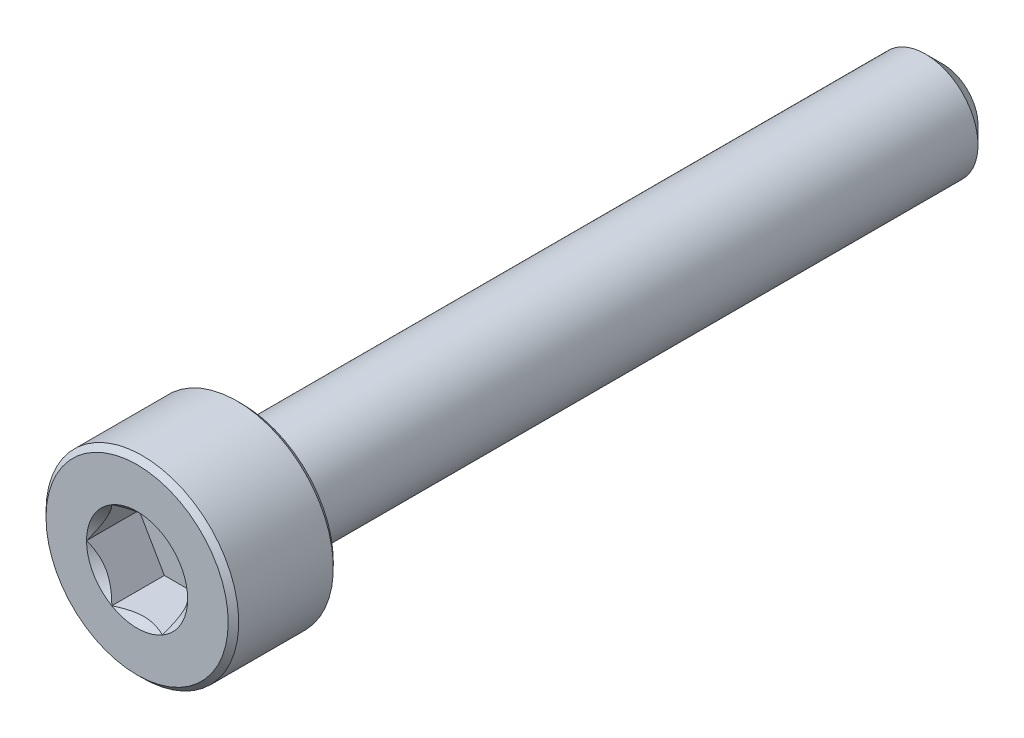
ISO-10303-21;
HEADER;
FILE_DESCRIPTION(('STEP AP214'),'2;1');
FILE_NAME('part.step','',(''),(''),'','','');
FILE_SCHEMA(('AUTOMOTIVE_DESIGN { 1 0 10303 214 1 1 1 1 }'));
ENDSEC;
DATA;
#1=APPLICATION_CONTEXT('core data for automotive mechanical design processes');
#2=APPLICATION_PROTOCOL_DEFINITION('international standard','automotive_design',2000,#1);
#3=PRODUCT_CONTEXT('',#1,'mechanical');
#4=PRODUCT('Part','Part','',(#3));
#5=PRODUCT_RELATED_PRODUCT_CATEGORY('part','',(#4));
#6=PRODUCT_DEFINITION_FORMATION('','',#4);
#7=PRODUCT_DEFINITION_CONTEXT('part definition',#1,'design');
#8=PRODUCT_DEFINITION('design','',#6,#7);
#9=PRODUCT_DEFINITION_SHAPE('','',#8);
#10=(LENGTH_UNIT() NAMED_UNIT(*) SI_UNIT(.MILLI.,.METRE.));
#11=(NAMED_UNIT(*) PLANE_ANGLE_UNIT() SI_UNIT($,.RADIAN.));
#12=(NAMED_UNIT(*) SI_UNIT($,.STERADIAN.) SOLID_ANGLE_UNIT());
#13=UNCERTAINTY_MEASURE_WITH_UNIT(LENGTH_MEASURE(1.E-05),#10,'distance_accuracy_value','');
#14=(GEOMETRIC_REPRESENTATION_CONTEXT(3) GLOBAL_UNCERTAINTY_ASSIGNED_CONTEXT((#13)) GLOBAL_UNIT_ASSIGNED_CONTEXT((#10,
#11,#12)) REPRESENTATION_CONTEXT('',''));
#15=CARTESIAN_POINT('',(0.,0.,0.));
#16=DIRECTION('',(0.,0.,1.));
#17=DIRECTION('',(1.,0.,0.));
#18=AXIS2_PLACEMENT_3D('',#15,#16,#17);
#19=CARTESIAN_POINT('',(1.44337567297406,0.,4.68118692087013));
#20=DIRECTION('',(0.866025403784439,0.5,0.));
#21=DIRECTION('',(0.,0.,-1.));
#22=AXIS2_PLACEMENT_3D('',#19,#20,#21);
#23=PLANE('',#22);
#24=DIRECTION('',(0.,0.,1.));
#25=VECTOR('',#24,1.);
#26=CARTESIAN_POINT('',(1.44337567297406,0.,4.68118692087013));
#27=LINE('',#26,#25);
#28=CARTESIAN_POINT('',(1.44337567297406,0.,10.));
#29=VERTEX_POINT('',#28);
#30=CARTESIAN_POINT('',(1.44337567297406,0.,11.5));
#31=VERTEX_POINT('',#30);
#32=EDGE_CURVE('E11',#29,#31,#27,.T.);
#33=ORIENTED_EDGE('',*,*,#32,.T.);
#34=CARTESIAN_POINT('',(1.44337567297406,0.,11.5));
#35=CARTESIAN_POINT('',(1.41857091071405,0.042963108504013,11.475219039718));
#36=CARTESIAN_POINT('',(1.39335141059849,0.0866445640456516,11.4518937494627));
#37=CARTESIAN_POINT('',(1.34192626179312,0.175715534563345,11.4091861389099));
#38=CARTESIAN_POINT('',(1.31571572524133,0.221113515564678,11.389827573349));
#39=CARTESIAN_POINT('',(1.26286346737866,0.312656311477562,11.3566662159029));
#40=CARTESIAN_POINT('',(1.2362351986357,0.358777825857968,11.3427800967733));
#41=CARTESIAN_POINT('',(1.18239258914488,0.452035961108156,11.3213859017897));
#42=CARTESIAN_POINT('',(1.15517989206246,0.499169735065891,11.3138618619115));
#43=CARTESIAN_POINT('',(1.10827633065602,0.580409086477769,11.3070728277861));
#44=CARTESIAN_POINT('',(1.08864599684083,0.614409822015216,11.3060681886446));
#45=CARTESIAN_POINT('',(1.0494198823342,0.682351445324212,11.3077634952111));
#46=CARTESIAN_POINT('',(1.02982411023275,0.716292318217464,11.3104642592515));
#47=CARTESIAN_POINT('',(0.990821754325344,0.783846380263975,11.3194142483348));
#48=CARTESIAN_POINT('',(0.9714153635362,0.81745923510231,11.3256667730471));
#49=CARTESIAN_POINT('',(0.932926594125732,0.884123739242043,11.3413835392354));
#50=CARTESIAN_POINT('',(0.913844358232443,0.917175141331234,11.3508491588483));
#51=CARTESIAN_POINT('',(0.864994007906013,1.00178643006415,11.3789283315699));
#52=CARTESIAN_POINT('',(0.835533298508111,1.05281387556834,11.3996493450535));
#53=CARTESIAN_POINT('',(0.777764485738233,1.1528723943787,11.4463235058095));
#54=CARTESIAN_POINT('',(0.749452981901493,1.20190935746262,11.4722596212216));
#55=CARTESIAN_POINT('',(0.721687836487032,1.25,11.5));
#56=B_SPLINE_CURVE_WITH_KNOTS('',3,(#34,#35,#36,#37,#38,#39,#40,#41,#42,#43,#44,#45,#46,#47,#48,
#49,#50,#51,#52,#53,#54,#55),.UNSPECIFIED.,.F.,.F.,(4,2,2,2,2,2,2,2,2,2,4),(0.,
0.166478683225849,0.33392692683284,0.498716658518449,0.66309165462856,0.780745575560542,
0.898425484353583,1.01621489977236,1.13405490052654,1.32111591641584,1.50757565758619),.UNSPECIFIED.);
#57=CARTESIAN_POINT('',(0.721687836487031,1.25,11.5));
#58=VERTEX_POINT('',#57);
#59=EDGE_CURVE('E105',#31,#58,#56,.T.);
#60=ORIENTED_EDGE('',*,*,#59,.T.);
#61=DIRECTION('',(0.,0.,1.));
#62=VECTOR('',#61,1.);
#63=CARTESIAN_POINT('',(0.721687836487032,1.25,4.68118692087013));
#64=LINE('',#63,#62);
#65=CARTESIAN_POINT('',(0.721687836487032,1.25,10.));
#66=VERTEX_POINT('',#65);
#67=EDGE_CURVE('E90',#66,#58,#64,.T.);
#68=ORIENTED_EDGE('',*,*,#67,.F.);
#69=DIRECTION('',(0.5,-0.866025403784439,0.));
#70=VECTOR('',#69,1.);
#71=CARTESIAN_POINT('',(1.44337567297406,0.,10.));
#72=LINE('',#71,#70);
#73=EDGE_CURVE('E110',#66,#29,#72,.T.);
#74=ORIENTED_EDGE('',*,*,#73,.T.);
#75=EDGE_LOOP('',(#33,#60,#68,#74));
#76=FACE_BOUND('',#75,.T.);
#77=ADVANCED_FACE('F17',(#76),#23,.F.);
#78=CARTESIAN_POINT('',(0.721687836487031,-1.25,4.68118692087013));
#79=DIRECTION('',(0.866025403784439,-0.5,0.));
#80=DIRECTION('',(0.,0.,-1.));
#81=AXIS2_PLACEMENT_3D('',#78,#79,#80);
#82=PLANE('',#81);
#83=DIRECTION('',(0.,0.,1.));
#84=VECTOR('',#83,1.);
#85=CARTESIAN_POINT('',(0.721687836487031,-1.25,4.68118692087013));
#86=LINE('',#85,#84);
#87=CARTESIAN_POINT('',(0.721687836487031,-1.25,10.));
#88=VERTEX_POINT('',#87);
#89=CARTESIAN_POINT('',(0.721687836487031,-1.25,11.5));
#90=VERTEX_POINT('',#89);
#91=EDGE_CURVE('E34',#88,#90,#86,.T.);
#92=ORIENTED_EDGE('',*,*,#91,.T.);
#93=CARTESIAN_POINT('',(0.721687836487031,-1.25,11.5));
#94=CARTESIAN_POINT('',(0.746492598747046,-1.20703689149599,11.475219039718));
#95=CARTESIAN_POINT('',(0.771712098862606,-1.16335543595435,11.4518937494627));
#96=CARTESIAN_POINT('',(0.823137247667978,-1.07428446543665,11.4091861389099));
#97=CARTESIAN_POINT('',(0.849347784219762,-1.02888648443532,11.389827573349));
#98=CARTESIAN_POINT('',(0.902200042082437,-0.937343688522437,11.3566662159029));
#99=CARTESIAN_POINT('',(0.928828310825398,-0.891222174142031,11.3427800967733));
#100=CARTESIAN_POINT('',(0.982670920316217,-0.797964038891842,11.3213859017897));
#101=CARTESIAN_POINT('',(1.00988361739864,-0.750830264934107,11.3138618619115));
#102=CARTESIAN_POINT('',(1.05678717880508,-0.669590913522229,11.3070728277861));
#103=CARTESIAN_POINT('',(1.07641751262027,-0.635590177984781,11.3060681886446));
#104=CARTESIAN_POINT('',(1.1156436271269,-0.567648554675786,11.3077634952111));
#105=CARTESIAN_POINT('',(1.13523939922835,-0.533707681782533,11.3104642592515));
#106=CARTESIAN_POINT('',(1.17424175513575,-0.466153619736022,11.3194142483348));
#107=CARTESIAN_POINT('',(1.1936481459249,-0.432540764897688,11.3256667730471));
#108=CARTESIAN_POINT('',(1.23213691533536,-0.365876260757955,11.3413835392354));
#109=CARTESIAN_POINT('',(1.25121915122865,-0.332824858668764,11.3508491588483));
#110=CARTESIAN_POINT('',(1.30006950155508,-0.248213569935847,11.3789283315699));
#111=CARTESIAN_POINT('',(1.32953021095299,-0.197186124431659,11.3996493450535));
#112=CARTESIAN_POINT('',(1.38729902372286,-0.097127605621297,11.4463235058095));
#113=CARTESIAN_POINT('',(1.4156105275596,-0.0480906425373818,11.4722596212216));
#114=CARTESIAN_POINT('',(1.44337567297406,0.,11.5));
#115=B_SPLINE_CURVE_WITH_KNOTS('',3,(#93,#94,#95,#96,#97,#98,#99,#100,#101,#102,#103,#104,#105,
#106,#107,#108,#109,#110,#111,#112,#113,#114),.UNSPECIFIED.,.F.,.F.,(4,2,2,2,2,2,2,2,2,2,4),(0.,
0.166478683225851,0.333926926832842,0.498716658518452,0.663091654628563,0.780745575560546,
0.898425484353586,1.01621489977237,1.13405490052654,1.32111591641585,1.5075756575862),.UNSPECIFIED.);
#116=EDGE_CURVE('E111',#90,#31,#115,.T.);
#117=ORIENTED_EDGE('',*,*,#116,.T.);
#118=ORIENTED_EDGE('',*,*,#32,.F.);
#119=DIRECTION('',(-0.5,-0.866025403784438,0.));
#120=VECTOR('',#119,1.);
#121=CARTESIAN_POINT('',(0.721687836487031,-1.25,10.));
#122=LINE('',#121,#120);
#123=EDGE_CURVE('E102',#29,#88,#122,.T.);
#124=ORIENTED_EDGE('',*,*,#123,.T.);
#125=EDGE_LOOP('',(#92,#117,#118,#124));
#126=FACE_BOUND('',#125,.T.);
#127=ADVANCED_FACE('F257',(#126),#82,.F.);
#128=CARTESIAN_POINT('',(-0.721687836487033,-1.25,4.68118692087013));
#129=DIRECTION('',(0.,-1.,0.));
#130=DIRECTION('',(-1.,0.,0.));
#131=AXIS2_PLACEMENT_3D('',#128,#129,#130);
#132=PLANE('',#131);
#133=DIRECTION('',(0.,0.,1.));
#134=VECTOR('',#133,1.);
#135=CARTESIAN_POINT('',(-0.721687836487033,-1.25,4.68118692087013));
#136=LINE('',#135,#134);
#137=CARTESIAN_POINT('',(-0.721687836487033,-1.25,10.));
#138=VERTEX_POINT('',#137);
#139=CARTESIAN_POINT('',(-0.721687836487032,-1.25,11.5));
#140=VERTEX_POINT('',#139);
#141=EDGE_CURVE('E150',#138,#140,#136,.T.);
#142=ORIENTED_EDGE('',*,*,#141,.T.);
#143=CARTESIAN_POINT('',(-0.721687836487033,-1.25,11.5));
#144=CARTESIAN_POINT('',(-0.672078311967003,-1.25,11.475219039718));
#145=CARTESIAN_POINT('',(-0.621639311735883,-1.25,11.4518937494627));
#146=CARTESIAN_POINT('',(-0.51878901412514,-1.25,11.4091861389099));
#147=CARTESIAN_POINT('',(-0.46636794102157,-1.25,11.389827573349));
#148=CARTESIAN_POINT('',(-0.360663425296221,-1.25,11.3566662159029));
#149=CARTESIAN_POINT('',(-0.307406887810299,-1.25,11.3427800967733));
#150=CARTESIAN_POINT('',(-0.199721668828662,-1.25,11.3213859017897));
#151=CARTESIAN_POINT('',(-0.145296274663819,-1.25,11.3138618619115));
#152=CARTESIAN_POINT('',(-0.0514891518509424,-1.25,11.3070728277861));
#153=CARTESIAN_POINT('',(-0.0122284842205615,-1.25,11.3060681886446));
#154=CARTESIAN_POINT('',(0.0662237447926961,-1.25,11.3077634952111));
#155=CARTESIAN_POINT('',(0.105415288995596,-1.25,11.3104642592515));
#156=CARTESIAN_POINT('',(0.183420000810408,-1.25,11.3194142483348));
#157=CARTESIAN_POINT('',(0.222232782388697,-1.25,11.3256667730471));
#158=CARTESIAN_POINT('',(0.299210321209632,-1.25,11.3413835392354));
#159=CARTESIAN_POINT('',(0.337374792996209,-1.25,11.3508491588483));
#160=CARTESIAN_POINT('',(0.435075493649071,-1.25,11.3789283315699));
#161=CARTESIAN_POINT('',(0.493996912444875,-1.25,11.3996493450535));
#162=CARTESIAN_POINT('',(0.60953453798463,-1.25,11.4463235058095));
#163=CARTESIAN_POINT('',(0.66615754565811,-1.25,11.4722596212216));
#164=CARTESIAN_POINT('',(0.721687836487031,-1.25,11.5));
#165=B_SPLINE_CURVE_WITH_KNOTS('',3,(#143,#144,#145,#146,#147,#148,#149,#150,#151,#152,#153,
#154,#155,#156,#157,#158,#159,#160,#161,#162,#163,#164),.UNSPECIFIED.,.F.,.F.,(4,2,2,2,2,2,2,2,
2,2,4),(0.,0.16647868322585,0.333926926832841,0.49871665851845,0.663091654628561,
0.780745575560543,0.898425484353584,1.01621489977236,1.13405490052654,1.32111591641584,
1.50757565758619),.UNSPECIFIED.);
#166=EDGE_CURVE('E268',#140,#90,#165,.T.);
#167=ORIENTED_EDGE('',*,*,#166,.T.);
#168=ORIENTED_EDGE('',*,*,#91,.F.);
#169=DIRECTION('',(-1.,0.,0.));
#170=VECTOR('',#169,1.);
#171=CARTESIAN_POINT('',(-0.721687836487033,-1.25,10.));
#172=LINE('',#171,#170);
#173=EDGE_CURVE('E498',#88,#138,#172,.T.);
#174=ORIENTED_EDGE('',*,*,#173,.T.);
#175=EDGE_LOOP('',(#142,#167,#168,#174));
#176=FACE_BOUND('',#175,.T.);
#177=ADVANCED_FACE('F261',(#176),#132,.F.);
#178=CARTESIAN_POINT('',(-1.44337567297406,0.,4.68118692087013));
#179=DIRECTION('',(-0.866025403784439,-0.5,0.));
#180=DIRECTION('',(-0.5,0.866025403784439,0.));
#181=AXIS2_PLACEMENT_3D('',#178,#179,#180);
#182=PLANE('',#181);
#183=DIRECTION('',(0.,0.,1.));
#184=VECTOR('',#183,1.);
#185=CARTESIAN_POINT('',(-1.44337567297406,0.,4.68118692087013));
#186=LINE('',#185,#184);
#187=CARTESIAN_POINT('',(-1.44337567297406,0.,10.));
#188=VERTEX_POINT('',#187);
#189=CARTESIAN_POINT('',(-1.44337567297406,0.,11.5));
#190=VERTEX_POINT('',#189);
#191=EDGE_CURVE('E157',#188,#190,#186,.T.);
#192=ORIENTED_EDGE('',*,*,#191,.T.);
#193=CARTESIAN_POINT('',(-1.44337567297406,0.,11.5));
#194=CARTESIAN_POINT('',(-1.41857091071405,-0.0429631085040121,11.475219039718));
#195=CARTESIAN_POINT('',(-1.39335141059849,-0.0866445640456512,11.4518937494627));
#196=CARTESIAN_POINT('',(-1.34192626179312,-0.175715534563345,11.4091861389099));
#197=CARTESIAN_POINT('',(-1.31571572524133,-0.221113515564677,11.389827573349));
#198=CARTESIAN_POINT('',(-1.26286346737866,-0.312656311477561,11.3566662159029));
#199=CARTESIAN_POINT('',(-1.2362351986357,-0.358777825857967,11.3427800967733));
#200=CARTESIAN_POINT('',(-1.18239258914488,-0.452035961108155,11.3213859017897));
#201=CARTESIAN_POINT('',(-1.15517989206246,-0.499169735065891,11.3138618619115));
#202=CARTESIAN_POINT('',(-1.10827633065602,-0.58040908647777,11.3070728277861));
#203=CARTESIAN_POINT('',(-1.08864599684083,-0.614409822015217,11.3060681886446));
#204=CARTESIAN_POINT('',(-1.0494198823342,-0.682351445324212,11.3077634952111));
#205=CARTESIAN_POINT('',(-1.02982411023275,-0.716292318217465,11.3104642592515));
#206=CARTESIAN_POINT('',(-0.990821754325343,-0.783846380263976,11.3194142483348));
#207=CARTESIAN_POINT('',(-0.971415363536199,-0.81745923510231,11.3256667730471));
#208=CARTESIAN_POINT('',(-0.932926594125732,-0.884123739242043,11.3413835392354));
#209=CARTESIAN_POINT('',(-0.913844358232443,-0.917175141331234,11.3508491588483));
#210=CARTESIAN_POINT('',(-0.864994007906012,-1.00178643006415,11.3789283315699));
#211=CARTESIAN_POINT('',(-0.83553329850811,-1.05281387556834,11.3996493450535));
#212=CARTESIAN_POINT('',(-0.777764485738233,-1.1528723943787,11.4463235058095));
#213=CARTESIAN_POINT('',(-0.749452981901492,-1.20190935746262,11.4722596212216));
#214=CARTESIAN_POINT('',(-0.721687836487032,-1.25,11.5));
#215=B_SPLINE_CURVE_WITH_KNOTS('',3,(#193,#194,#195,#196,#197,#198,#199,#200,#201,#202,#203,
#204,#205,#206,#207,#208,#209,#210,#211,#212,#213,#214),.UNSPECIFIED.,.F.,.F.,(4,2,2,2,2,2,2,2,
2,2,4),(0.,0.166478683225852,0.333926926832842,0.49871665851845,0.663091654628562,
0.780745575560544,0.898425484353585,1.01621489977236,1.13405490052654,1.32111591641584,
1.5075756575862),.UNSPECIFIED.);
#216=EDGE_CURVE('E209',#190,#140,#215,.T.);
#217=ORIENTED_EDGE('',*,*,#216,.T.);
#218=ORIENTED_EDGE('',*,*,#141,.F.);
#219=DIRECTION('',(-0.5,0.866025403784439,0.));
#220=VECTOR('',#219,1.);
#221=CARTESIAN_POINT('',(-1.44337567297406,0.,10.));
#222=LINE('',#221,#220);
#223=EDGE_CURVE('E478',#138,#188,#222,.T.);
#224=ORIENTED_EDGE('',*,*,#223,.T.);
#225=EDGE_LOOP('',(#192,#217,#218,#224));
#226=FACE_BOUND('',#225,.T.);
#227=ADVANCED_FACE('F197',(#226),#182,.F.);
#228=CARTESIAN_POINT('',(-0.721687836487032,1.25,4.68118692087013));
#229=DIRECTION('',(-0.866025403784439,0.5,0.));
#230=DIRECTION('',(0.,0.,1.));
#231=AXIS2_PLACEMENT_3D('',#228,#229,#230);
#232=PLANE('',#231);
#233=DIRECTION('',(0.,0.,1.));
#234=VECTOR('',#233,1.);
#235=CARTESIAN_POINT('',(-0.721687836487032,1.25,4.68118692087013));
#236=LINE('',#235,#234);
#237=CARTESIAN_POINT('',(-0.721687836487032,1.25,10.));
#238=VERTEX_POINT('',#237);
#239=CARTESIAN_POINT('',(-0.721687836487031,1.25,11.5));
#240=VERTEX_POINT('',#239);
#241=EDGE_CURVE('E101',#238,#240,#236,.T.);
#242=ORIENTED_EDGE('',*,*,#241,.T.);
#243=CARTESIAN_POINT('',(-0.721687836487032,1.25,11.5));
#244=CARTESIAN_POINT('',(-0.746492598747047,1.20703689149599,11.475219039718));
#245=CARTESIAN_POINT('',(-0.771712098862606,1.16335543595435,11.4518937494627));
#246=CARTESIAN_POINT('',(-0.823137247667978,1.07428446543666,11.4091861389099));
#247=CARTESIAN_POINT('',(-0.849347784219763,1.02888648443532,11.389827573349));
#248=CARTESIAN_POINT('',(-0.902200042082437,0.937343688522439,11.3566662159029));
#249=CARTESIAN_POINT('',(-0.928828310825398,0.891222174142032,11.3427800967733));
#250=CARTESIAN_POINT('',(-0.982670920316217,0.797964038891844,11.3213859017897));
#251=CARTESIAN_POINT('',(-1.00988361739864,0.750830264934109,11.3138618619115));
#252=CARTESIAN_POINT('',(-1.05678717880508,0.66959091352223,11.3070728277861));
#253=CARTESIAN_POINT('',(-1.07641751262027,0.635590177984783,11.3060681886446));
#254=CARTESIAN_POINT('',(-1.1156436271269,0.567648554675788,11.3077634952111));
#255=CARTESIAN_POINT('',(-1.13523939922835,0.533707681782535,11.3104642592515));
#256=CARTESIAN_POINT('',(-1.17424175513575,0.466153619736024,11.3194142483348));
#257=CARTESIAN_POINT('',(-1.1936481459249,0.43254076489769,11.3256667730471));
#258=CARTESIAN_POINT('',(-1.23213691533536,0.365876260757957,11.3413835392354));
#259=CARTESIAN_POINT('',(-1.25121915122865,0.332824858668766,11.3508491588483));
#260=CARTESIAN_POINT('',(-1.30006950155508,0.248213569935849,11.3789283315699));
#261=CARTESIAN_POINT('',(-1.32953021095299,0.197186124431661,11.3996493450535));
#262=CARTESIAN_POINT('',(-1.38729902372286,0.0971276056212995,11.4463235058095));
#263=CARTESIAN_POINT('',(-1.4156105275596,0.0480906425373842,11.4722596212216));
#264=CARTESIAN_POINT('',(-1.44337567297406,0.,11.5));
#265=B_SPLINE_CURVE_WITH_KNOTS('',3,(#243,#244,#245,#246,#247,#248,#249,#250,#251,#252,#253,
#254,#255,#256,#257,#258,#259,#260,#261,#262,#263,#264),.UNSPECIFIED.,.F.,.F.,(4,2,2,2,2,2,2,2,
2,2,4),(0.,0.166478683225849,0.33392692683284,0.49871665851845,0.663091654628561,
0.780745575560543,0.898425484353583,1.01621489977236,1.13405490052654,1.32111591641584,
1.50757565758619),.UNSPECIFIED.);
#266=EDGE_CURVE('E119',#240,#190,#265,.T.);
#267=ORIENTED_EDGE('',*,*,#266,.T.);
#268=ORIENTED_EDGE('',*,*,#191,.F.);
#269=DIRECTION('',(0.5,0.866025403784439,0.));
#270=VECTOR('',#269,1.);
#271=CARTESIAN_POINT('',(-0.721687836487032,1.25,10.));
#272=LINE('',#271,#270);
#273=EDGE_CURVE('E474',#188,#238,#272,.T.);
#274=ORIENTED_EDGE('',*,*,#273,.T.);
#275=EDGE_LOOP('',(#242,#267,#268,#274));
#276=FACE_BOUND('',#275,.T.);
#277=ADVANCED_FACE('F193',(#276),#232,.F.);
#278=CARTESIAN_POINT('',(0.721687836487032,1.25,4.68118692087013));
#279=DIRECTION('',(0.,1.,0.));
#280=DIRECTION('',(1.,0.,0.));
#281=AXIS2_PLACEMENT_3D('',#278,#279,#280);
#282=PLANE('',#281);
#283=ORIENTED_EDGE('',*,*,#67,.T.);
#284=CARTESIAN_POINT('',(0.721687836487031,1.25,11.5));
#285=CARTESIAN_POINT('',(0.672078311967001,1.25,11.475219039718));
#286=CARTESIAN_POINT('',(0.621639311735882,1.25,11.4518937494627));
#287=CARTESIAN_POINT('',(0.518789014125139,1.25,11.4091861389099));
#288=CARTESIAN_POINT('',(0.466367941021569,1.25,11.389827573349));
#289=CARTESIAN_POINT('',(0.36066342529622,1.25,11.3566662159029));
#290=CARTESIAN_POINT('',(0.307406887810298,1.25,11.3427800967733));
#291=CARTESIAN_POINT('',(0.199721668828661,1.25,11.3213859017897));
#292=CARTESIAN_POINT('',(0.145296274663818,1.25,11.3138618619115));
#293=CARTESIAN_POINT('',(0.0514891518509412,1.25,11.3070728277861));
#294=CARTESIAN_POINT('',(0.0122284842205604,1.25,11.3060681886446));
#295=CARTESIAN_POINT('',(-0.0662237447926971,1.25,11.3077634952111));
#296=CARTESIAN_POINT('',(-0.105415288995597,1.25,11.3104642592515));
#297=CARTESIAN_POINT('',(-0.183420000810409,1.25,11.3194142483348));
#298=CARTESIAN_POINT('',(-0.222232782388698,1.25,11.3256667730471));
#299=CARTESIAN_POINT('',(-0.299210321209633,1.25,11.3413835392354));
#300=CARTESIAN_POINT('',(-0.337374792996211,1.25,11.3508491588483));
#301=CARTESIAN_POINT('',(-0.435075493649072,1.25,11.3789283315699));
#302=CARTESIAN_POINT('',(-0.493996912444876,1.25,11.3996493450535));
#303=CARTESIAN_POINT('',(-0.609534537984631,1.25,11.4463235058095));
#304=CARTESIAN_POINT('',(-0.666157545658111,1.25,11.4722596212216));
#305=CARTESIAN_POINT('',(-0.721687836487031,1.25,11.5));
#306=B_SPLINE_CURVE_WITH_KNOTS('',3,(#284,#285,#286,#287,#288,#289,#290,#291,#292,#293,#294,
#295,#296,#297,#298,#299,#300,#301,#302,#303,#304,#305),.UNSPECIFIED.,.F.,.F.,(4,2,2,2,2,2,2,2,
2,2,4),(0.,0.166478683225849,0.33392692683284,0.49871665851845,0.66309165462856,
0.780745575560543,0.898425484353583,1.01621489977236,1.13405490052654,1.32111591641584,
1.50757565758619),.UNSPECIFIED.);
#307=EDGE_CURVE('E21',#58,#240,#306,.T.);
#308=ORIENTED_EDGE('',*,*,#307,.T.);
#309=ORIENTED_EDGE('',*,*,#241,.F.);
#310=DIRECTION('',(1.,0.,0.));
#311=VECTOR('',#310,1.);
#312=CARTESIAN_POINT('',(0.721687836487032,1.25,10.));
#313=LINE('',#312,#311);
#314=EDGE_CURVE('E96',#238,#66,#313,.T.);
#315=ORIENTED_EDGE('',*,*,#314,.T.);
#316=EDGE_LOOP('',(#283,#308,#309,#315));
#317=FACE_BOUND('',#316,.T.);
#318=ADVANCED_FACE('F92',(#317),#282,.F.);
#319=CARTESIAN_POINT('',(0.,2.6,10.));
#320=DIRECTION('',(0.,0.,1.));
#321=DIRECTION('',(1.,0.,0.));
#322=AXIS2_PLACEMENT_3D('',#319,#320,#321);
#323=PLANE('',#322);
#324=ORIENTED_EDGE('',*,*,#73,.F.);
#325=ORIENTED_EDGE('',*,*,#314,.F.);
#326=ORIENTED_EDGE('',*,*,#273,.F.);
#327=ORIENTED_EDGE('',*,*,#223,.F.);
#328=ORIENTED_EDGE('',*,*,#173,.F.);
#329=ORIENTED_EDGE('',*,*,#123,.F.);
#330=EDGE_LOOP('',(#324,#325,#326,#327,#328,#329));
#331=FACE_BOUND('',#330,.T.);
#332=ADVANCED_FACE('F184',(#331),#323,.T.);
#333=CARTESIAN_POINT('',(0.,0.,11.5));
#334=DIRECTION('',(0.,0.,1.));
#335=DIRECTION('',(1.,0.,0.));
#336=AXIS2_PLACEMENT_3D('',#333,#334,#335);
#337=CONICAL_SURFACE('',#336,1.44337567297406,0.78539816339745);
#338=CARTESIAN_POINT('',(0.,0.,11.5));
#339=DIRECTION('',(0.,0.,1.));
#340=DIRECTION('',(1.,0.,0.));
#341=AXIS2_PLACEMENT_3D('',#338,#339,#340);
#342=CIRCLE('',#341,1.44337567297406);
#343=EDGE_CURVE('E125',#31,#58,#342,.T.);
#344=ORIENTED_EDGE('',*,*,#343,.T.);
#345=ORIENTED_EDGE('',*,*,#59,.F.);
#346=EDGE_LOOP('',(#344,#345));
#347=FACE_BOUND('',#346,.T.);
#348=ADVANCED_FACE('F131',(#347),#337,.F.);
#349=CARTESIAN_POINT('',(0.,0.,11.5));
#350=DIRECTION('',(0.,0.,1.));
#351=DIRECTION('',(1.,0.,0.));
#352=AXIS2_PLACEMENT_3D('',#349,#350,#351);
#353=CONICAL_SURFACE('',#352,1.44337567297406,0.78539816339745);
#354=CARTESIAN_POINT('',(0.,0.,11.5));
#355=DIRECTION('',(0.,0.,1.));
#356=DIRECTION('',(1.,0.,0.));
#357=AXIS2_PLACEMENT_3D('',#354,#355,#356);
#358=CIRCLE('',#357,1.44337567297406);
#359=EDGE_CURVE('E133',#90,#31,#358,.T.);
#360=ORIENTED_EDGE('',*,*,#359,.T.);
#361=ORIENTED_EDGE('',*,*,#116,.F.);
#362=EDGE_LOOP('',(#360,#361));
#363=FACE_BOUND('',#362,.T.);
#364=ADVANCED_FACE('F183',(#363),#353,.F.);
#365=CARTESIAN_POINT('',(0.,0.,11.5));
#366=DIRECTION('',(0.,0.,1.));
#367=DIRECTION('',(1.,0.,0.));
#368=AXIS2_PLACEMENT_3D('',#365,#366,#367);
#369=CONICAL_SURFACE('',#368,1.44337567297406,0.78539816339745);
#370=CARTESIAN_POINT('',(0.,0.,11.5));
#371=DIRECTION('',(0.,0.,1.));
#372=DIRECTION('',(1.,0.,0.));
#373=AXIS2_PLACEMENT_3D('',#370,#371,#372);
#374=CIRCLE('',#373,1.44337567297406);
#375=EDGE_CURVE('E141',#140,#90,#374,.T.);
#376=ORIENTED_EDGE('',*,*,#375,.T.);
#377=ORIENTED_EDGE('',*,*,#166,.F.);
#378=EDGE_LOOP('',(#376,#377));
#379=FACE_BOUND('',#378,.T.);
#380=ADVANCED_FACE('F185',(#379),#369,.F.);
#381=CARTESIAN_POINT('',(0.,0.,11.5));
#382=DIRECTION('',(0.,0.,1.));
#383=DIRECTION('',(1.,0.,0.));
#384=AXIS2_PLACEMENT_3D('',#381,#382,#383);
#385=CONICAL_SURFACE('',#384,1.44337567297406,0.78539816339745);
#386=CARTESIAN_POINT('',(0.,0.,11.5));
#387=DIRECTION('',(0.,0.,1.));
#388=DIRECTION('',(1.,0.,0.));
#389=AXIS2_PLACEMENT_3D('',#386,#387,#388);
#390=CIRCLE('',#389,1.44337567297406);
#391=EDGE_CURVE('E154',#190,#140,#390,.T.);
#392=ORIENTED_EDGE('',*,*,#391,.T.);
#393=ORIENTED_EDGE('',*,*,#216,.F.);
#394=EDGE_LOOP('',(#392,#393));
#395=FACE_BOUND('',#394,.T.);
#396=ADVANCED_FACE('F219',(#395),#385,.F.);
#397=CARTESIAN_POINT('',(0.,0.,11.5));
#398=DIRECTION('',(0.,0.,1.));
#399=DIRECTION('',(1.,0.,0.));
#400=AXIS2_PLACEMENT_3D('',#397,#398,#399);
#401=CONICAL_SURFACE('',#400,1.44337567297406,0.78539816339745);
#402=CARTESIAN_POINT('',(0.,0.,11.5));
#403=DIRECTION('',(0.,0.,1.));
#404=DIRECTION('',(1.,0.,0.));
#405=AXIS2_PLACEMENT_3D('',#402,#403,#404);
#406=CIRCLE('',#405,1.44337567297406);
#407=EDGE_CURVE('E128',#240,#190,#406,.T.);
#408=ORIENTED_EDGE('',*,*,#407,.T.);
#409=ORIENTED_EDGE('',*,*,#266,.F.);
#410=EDGE_LOOP('',(#408,#409));
#411=FACE_BOUND('',#410,.T.);
#412=ADVANCED_FACE('F215',(#411),#401,.F.);
#413=CARTESIAN_POINT('',(0.,0.,11.5));
#414=DIRECTION('',(0.,0.,1.));
#415=DIRECTION('',(1.,0.,0.));
#416=AXIS2_PLACEMENT_3D('',#413,#414,#415);
#417=CONICAL_SURFACE('',#416,1.44337567297406,0.78539816339745);
#418=CARTESIAN_POINT('',(0.,0.,11.5));
#419=DIRECTION('',(0.,0.,1.));
#420=DIRECTION('',(1.,0.,0.));
#421=AXIS2_PLACEMENT_3D('',#418,#419,#420);
#422=CIRCLE('',#421,1.44337567297406);
#423=EDGE_CURVE('E116',#58,#240,#422,.T.);
#424=ORIENTED_EDGE('',*,*,#423,.T.);
#425=ORIENTED_EDGE('',*,*,#307,.F.);
#426=EDGE_LOOP('',(#424,#425));
#427=FACE_BOUND('',#426,.T.);
#428=ADVANCED_FACE('F115',(#427),#417,.F.);
#429=CARTESIAN_POINT('',(0.,1.,-11.5));
#430=DIRECTION('',(0.,0.,-1.));
#431=DIRECTION('',(0.,-1.,0.));
#432=AXIS2_PLACEMENT_3D('',#429,#430,#431);
#433=PLANE('',#432);
#434=CARTESIAN_POINT('',(0.,0.,-11.5));
#435=DIRECTION('',(0.,0.,-1.));
#436=DIRECTION('',(-1.,0.,0.));
#437=AXIS2_PLACEMENT_3D('',#434,#435,#436);
#438=CIRCLE('',#437,1.);
#439=CARTESIAN_POINT('',(-1.,0.,-11.5));
#440=VERTEX_POINT('',#439);
#441=EDGE_CURVE('E430',#440,#440,#438,.T.);
#442=ORIENTED_EDGE('',*,*,#441,.T.);
#443=EDGE_LOOP('',(#442));
#444=FACE_BOUND('',#443,.T.);
#445=ADVANCED_FACE('F234',(#444),#433,.T.);
#446=CARTESIAN_POINT('',(0.,2.6,8.5));
#447=DIRECTION('',(0.,0.,-1.));
#448=DIRECTION('',(0.,-1.,0.));
#449=AXIS2_PLACEMENT_3D('',#446,#447,#448);
#450=PLANE('',#449);
#451=CARTESIAN_POINT('',(0.,0.,8.5));
#452=DIRECTION('',(0.,0.,-1.));
#453=DIRECTION('',(-1.,0.,0.));
#454=AXIS2_PLACEMENT_3D('',#451,#452,#453);
#455=CIRCLE('',#454,1.5);
#456=CARTESIAN_POINT('',(-1.5,0.,8.5));
#457=VERTEX_POINT('',#456);
#458=EDGE_CURVE('E416',#457,#457,#455,.T.);
#459=ORIENTED_EDGE('',*,*,#458,.F.);
#460=EDGE_LOOP('',(#459));
#461=FACE_BOUND('',#460,.T.);
#462=CARTESIAN_POINT('',(0.,0.,8.5));
#463=DIRECTION('',(0.,0.,-1.));
#464=DIRECTION('',(-1.,0.,0.));
#465=AXIS2_PLACEMENT_3D('',#462,#463,#464);
#466=CIRCLE('',#465,2.6);
#467=CARTESIAN_POINT('',(-2.6,0.,8.5));
#468=VERTEX_POINT('',#467);
#469=EDGE_CURVE('E406',#468,#468,#466,.T.);
#470=ORIENTED_EDGE('',*,*,#469,.T.);
#471=EDGE_LOOP('',(#470));
#472=FACE_BOUND('',#471,.T.);
#473=ADVANCED_FACE('F247',(#461,#472),#450,.T.);
#474=CARTESIAN_POINT('',(0.,2.6,11.5));
#475=DIRECTION('',(0.,0.,1.));
#476=DIRECTION('',(1.,0.,0.));
#477=AXIS2_PLACEMENT_3D('',#474,#475,#476);
#478=PLANE('',#477);
#479=ORIENTED_EDGE('',*,*,#343,.F.);
#480=ORIENTED_EDGE('',*,*,#359,.F.);
#481=ORIENTED_EDGE('',*,*,#375,.F.);
#482=ORIENTED_EDGE('',*,*,#391,.F.);
#483=ORIENTED_EDGE('',*,*,#407,.F.);
#484=ORIENTED_EDGE('',*,*,#423,.F.);
#485=EDGE_LOOP('',(#479,#480,#481,#482,#483,#484));
#486=FACE_BOUND('',#485,.T.);
#487=CARTESIAN_POINT('',(0.,0.,11.5));
#488=DIRECTION('',(0.,0.,-1.));
#489=DIRECTION('',(-1.,0.,0.));
#490=AXIS2_PLACEMENT_3D('',#487,#488,#489);
#491=CIRCLE('',#490,2.6);
#492=CARTESIAN_POINT('',(-2.6,0.,11.5));
#493=VERTEX_POINT('',#492);
#494=EDGE_CURVE('E134',#493,#493,#491,.T.);
#495=ORIENTED_EDGE('',*,*,#494,.F.);
#496=EDGE_LOOP('',(#495));
#497=FACE_BOUND('',#496,.T.);
#498=ADVANCED_FACE('F122',(#486,#497),#478,.T.);
#499=CARTESIAN_POINT('',(0.,0.,11.35));
#500=DIRECTION('',(0.,0.,-1.));
#501=DIRECTION('',(-1.,0.,0.));
#502=AXIS2_PLACEMENT_3D('',#499,#500,#501);
#503=CONICAL_SURFACE('',#502,2.75,0.785398163397447);
#504=CARTESIAN_POINT('',(0.,0.,11.35));
#505=DIRECTION('',(0.,0.,-1.));
#506=DIRECTION('',(-1.,0.,0.));
#507=AXIS2_PLACEMENT_3D('',#504,#505,#506);
#508=CIRCLE('',#507,2.75);
#509=CARTESIAN_POINT('',(-2.75,0.,11.35));
#510=VERTEX_POINT('',#509);
#511=EDGE_CURVE('E145',#510,#510,#508,.T.);
#512=ORIENTED_EDGE('',*,*,#511,.F.);
#513=EDGE_LOOP('',(#512));
#514=FACE_BOUND('',#513,.T.);
#515=ORIENTED_EDGE('',*,*,#494,.T.);
#516=EDGE_LOOP('',(#515));
#517=FACE_BOUND('',#516,.T.);
#518=ADVANCED_FACE('F235',(#514,#517),#503,.T.);
#519=CARTESIAN_POINT('',(0.,0.,-11.5));
#520=DIRECTION('',(0.,0.,-1.));
#521=DIRECTION('',(-1.,0.,0.));
#522=AXIS2_PLACEMENT_3D('',#519,#520,#521);
#523=CYLINDRICAL_SURFACE('',#522,2.75);
#524=CARTESIAN_POINT('',(0.,0.,8.65));
#525=DIRECTION('',(0.,0.,-1.));
#526=DIRECTION('',(-1.,0.,0.));
#527=AXIS2_PLACEMENT_3D('',#524,#525,#526);
#528=CIRCLE('',#527,2.75);
#529=CARTESIAN_POINT('',(-2.75,0.,8.65));
#530=VERTEX_POINT('',#529);
#531=EDGE_CURVE('E395',#530,#530,#528,.T.);
#532=ORIENTED_EDGE('',*,*,#531,.F.);
#533=EDGE_LOOP('',(#532));
#534=FACE_BOUND('',#533,.T.);
#535=ORIENTED_EDGE('',*,*,#511,.T.);
#536=EDGE_LOOP('',(#535));
#537=FACE_BOUND('',#536,.T.);
#538=ADVANCED_FACE('F229',(#534,#537),#523,.T.);
#539=CARTESIAN_POINT('',(0.,0.,8.5));
#540=DIRECTION('',(0.,0.,1.));
#541=DIRECTION('',(1.,0.,0.));
#542=AXIS2_PLACEMENT_3D('',#539,#540,#541);
#543=CONICAL_SURFACE('',#542,2.6,0.785398163397448);
#544=ORIENTED_EDGE('',*,*,#531,.T.);
#545=EDGE_LOOP('',(#544));
#546=FACE_BOUND('',#545,.T.);
#547=ORIENTED_EDGE('',*,*,#469,.F.);
#548=EDGE_LOOP('',(#547));
#549=FACE_BOUND('',#548,.T.);
#550=ADVANCED_FACE('F227',(#546,#549),#543,.T.);
#551=CARTESIAN_POINT('',(0.,0.,-11.5));
#552=DIRECTION('',(0.,0.,-1.));
#553=DIRECTION('',(-1.,0.,0.));
#554=AXIS2_PLACEMENT_3D('',#551,#552,#553);
#555=CYLINDRICAL_SURFACE('',#554,1.5);
#556=CARTESIAN_POINT('',(0.,0.,-11.));
#557=DIRECTION('',(0.,0.,-1.));
#558=DIRECTION('',(-1.,0.,0.));
#559=AXIS2_PLACEMENT_3D('',#556,#557,#558);
#560=CIRCLE('',#559,1.5);
#561=CARTESIAN_POINT('',(-1.5,0.,-11.));
#562=VERTEX_POINT('',#561);
#563=EDGE_CURVE('E423',#562,#562,#560,.T.);
#564=ORIENTED_EDGE('',*,*,#563,.F.);
#565=EDGE_LOOP('',(#564));
#566=FACE_BOUND('',#565,.T.);
#567=ORIENTED_EDGE('',*,*,#458,.T.);
#568=EDGE_LOOP('',(#567));
#569=FACE_BOUND('',#568,.T.);
#570=ADVANCED_FACE('F221',(#566,#569),#555,.T.);
#571=CARTESIAN_POINT('',(0.,0.,-11.5));
#572=DIRECTION('',(0.,0.,1.));
#573=DIRECTION('',(1.,0.,0.));
#574=AXIS2_PLACEMENT_3D('',#571,#572,#573);
#575=CONICAL_SURFACE('',#574,1.,0.785398163397443);
#576=ORIENTED_EDGE('',*,*,#563,.T.);
#577=EDGE_LOOP('',(#576));
#578=FACE_BOUND('',#577,.T.);
#579=ORIENTED_EDGE('',*,*,#441,.F.);
#580=EDGE_LOOP('',(#579));
#581=FACE_BOUND('',#580,.T.);
#582=ADVANCED_FACE('F365',(#578,#581),#575,.T.);
#583=CLOSED_SHELL('',(#77,#127,#177,#227,#277,#318,#332,#348,#364,#380,#396,#412,#428,#445,#473,
#498,#518,#538,#550,#570,#582));
#584=MANIFOLD_SOLID_BREP('B1',#583);
#585=ADVANCED_BREP_SHAPE_REPRESENTATION('',(#18,#584),#14);
#586=SHAPE_DEFINITION_REPRESENTATION(#9,#585);
ENDSEC;
END-ISO-10303-21;
